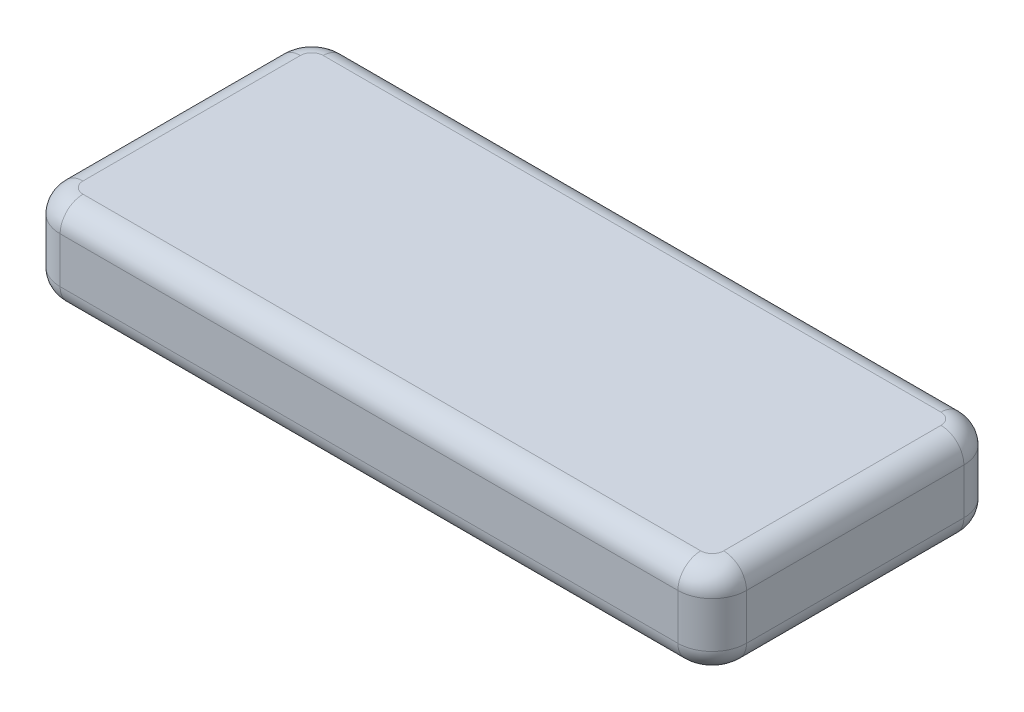
ISO-10303-21;
HEADER;
FILE_DESCRIPTION(('STEP AP214'),'2;1');
FILE_NAME('part.step','',(''),(''),'','','');
FILE_SCHEMA(('AUTOMOTIVE_DESIGN { 1 0 10303 214 1 1 1 1 }'));
ENDSEC;
DATA;
#1=APPLICATION_CONTEXT('core data for automotive mechanical design processes');
#2=APPLICATION_PROTOCOL_DEFINITION('international standard','automotive_design',2000,#1);
#3=PRODUCT_CONTEXT('',#1,'mechanical');
#4=PRODUCT('Part','Part','',(#3));
#5=PRODUCT_RELATED_PRODUCT_CATEGORY('part','',(#4));
#6=PRODUCT_DEFINITION_FORMATION('','',#4);
#7=PRODUCT_DEFINITION_CONTEXT('part definition',#1,'design');
#8=PRODUCT_DEFINITION('design','',#6,#7);
#9=PRODUCT_DEFINITION_SHAPE('','',#8);
#10=(LENGTH_UNIT() NAMED_UNIT(*) SI_UNIT(.MILLI.,.METRE.));
#11=(NAMED_UNIT(*) PLANE_ANGLE_UNIT() SI_UNIT($,.RADIAN.));
#12=(NAMED_UNIT(*) SI_UNIT($,.STERADIAN.) SOLID_ANGLE_UNIT());
#13=UNCERTAINTY_MEASURE_WITH_UNIT(LENGTH_MEASURE(1.E-05),#10,'distance_accuracy_value','');
#14=(GEOMETRIC_REPRESENTATION_CONTEXT(3) GLOBAL_UNCERTAINTY_ASSIGNED_CONTEXT((#13)) GLOBAL_UNIT_ASSIGNED_CONTEXT((#10,
#11,#12)) REPRESENTATION_CONTEXT('',''));
#15=CARTESIAN_POINT('',(0.,0.,0.));
#16=DIRECTION('',(0.,0.,1.));
#17=DIRECTION('',(1.,0.,0.));
#18=AXIS2_PLACEMENT_3D('',#15,#16,#17);
#19=CARTESIAN_POINT('',(27.,4.,9.5));
#20=DIRECTION('',(0.,-1.,0.));
#21=DIRECTION('',(0.,0.,-1.));
#22=AXIS2_PLACEMENT_3D('',#19,#20,#21);
#23=CYLINDRICAL_SURFACE('',#22,3.);
#24=DIRECTION('',(0.,-1.,0.));
#25=VECTOR('',#24,1.);
#26=CARTESIAN_POINT('',(30.,4.,9.49999999999998));
#27=LINE('',#26,#25);
#28=CARTESIAN_POINT('',(30.,2.,9.49999999999998));
#29=VERTEX_POINT('',#28);
#30=CARTESIAN_POINT('',(30.,-2.,9.49999999999998));
#31=VERTEX_POINT('',#30);
#32=EDGE_CURVE('E175',#29,#31,#27,.T.);
#33=ORIENTED_EDGE('',*,*,#32,.F.);
#34=CARTESIAN_POINT('',(27.,2.,9.5));
#35=DIRECTION('',(0.,1.,0.));
#36=DIRECTION('',(0.,0.,1.));
#37=AXIS2_PLACEMENT_3D('',#34,#35,#36);
#38=CIRCLE('',#37,3.);
#39=CARTESIAN_POINT('',(27.,2.,12.5));
#40=VERTEX_POINT('',#39);
#41=EDGE_CURVE('E212',#29,#40,#38,.F.);
#42=ORIENTED_EDGE('',*,*,#41,.T.);
#43=DIRECTION('',(0.,-1.,0.));
#44=VECTOR('',#43,1.);
#45=CARTESIAN_POINT('',(27.,4.,12.5));
#46=LINE('',#45,#44);
#47=CARTESIAN_POINT('',(27.,-2.,12.5));
#48=VERTEX_POINT('',#47);
#49=EDGE_CURVE('E246',#40,#48,#46,.T.);
#50=ORIENTED_EDGE('',*,*,#49,.T.);
#51=CARTESIAN_POINT('',(27.,-2.,9.5));
#52=DIRECTION('',(0.,1.,0.));
#53=DIRECTION('',(0.,0.,1.));
#54=AXIS2_PLACEMENT_3D('',#51,#52,#53);
#55=CIRCLE('',#54,3.);
#56=EDGE_CURVE('E210',#48,#31,#55,.T.);
#57=ORIENTED_EDGE('',*,*,#56,.T.);
#58=EDGE_LOOP('',(#33,#42,#50,#57));
#59=FACE_BOUND('',#58,.T.);
#60=ADVANCED_FACE('F41',(#59),#23,.T.);
#61=CARTESIAN_POINT('',(30.,4.,9.49999999999998));
#62=DIRECTION('',(-1.,0.,0.));
#63=DIRECTION('',(0.,0.,1.));
#64=AXIS2_PLACEMENT_3D('',#61,#62,#63);
#65=PLANE('',#64);
#66=DIRECTION('',(0.,-1.,0.));
#67=VECTOR('',#66,1.);
#68=CARTESIAN_POINT('',(30.,4.,-9.49999999999998));
#69=LINE('',#68,#67);
#70=CARTESIAN_POINT('',(30.,2.,-9.49999999999998));
#71=VERTEX_POINT('',#70);
#72=CARTESIAN_POINT('',(30.,-2.,-9.49999999999998));
#73=VERTEX_POINT('',#72);
#74=EDGE_CURVE('E302',#71,#73,#69,.T.);
#75=ORIENTED_EDGE('',*,*,#74,.F.);
#76=DIRECTION('',(0.,0.,-1.));
#77=VECTOR('',#76,1.);
#78=CARTESIAN_POINT('',(30.,2.,9.49999999999998));
#79=LINE('',#78,#77);
#80=EDGE_CURVE('E208',#71,#29,#79,.F.);
#81=ORIENTED_EDGE('',*,*,#80,.T.);
#82=ORIENTED_EDGE('',*,*,#32,.T.);
#83=DIRECTION('',(0.,0.,-1.));
#84=VECTOR('',#83,1.);
#85=CARTESIAN_POINT('',(30.,-2.,9.49999999999998));
#86=LINE('',#85,#84);
#87=EDGE_CURVE('E205',#31,#73,#86,.T.);
#88=ORIENTED_EDGE('',*,*,#87,.T.);
#89=EDGE_LOOP('',(#75,#81,#82,#88));
#90=FACE_BOUND('',#89,.T.);
#91=ADVANCED_FACE('F299',(#90),#65,.F.);
#92=CARTESIAN_POINT('',(27.,4.,-9.5));
#93=DIRECTION('',(0.,-1.,0.));
#94=DIRECTION('',(0.,0.,-1.));
#95=AXIS2_PLACEMENT_3D('',#92,#93,#94);
#96=CYLINDRICAL_SURFACE('',#95,3.);
#97=DIRECTION('',(0.,-1.,0.));
#98=VECTOR('',#97,1.);
#99=CARTESIAN_POINT('',(27.,4.,-12.5));
#100=LINE('',#99,#98);
#101=CARTESIAN_POINT('',(27.,2.,-12.5));
#102=VERTEX_POINT('',#101);
#103=CARTESIAN_POINT('',(27.,-2.,-12.5));
#104=VERTEX_POINT('',#103);
#105=EDGE_CURVE('E304',#102,#104,#100,.T.);
#106=ORIENTED_EDGE('',*,*,#105,.F.);
#107=CARTESIAN_POINT('',(27.,2.,-9.5));
#108=DIRECTION('',(0.,1.,0.));
#109=DIRECTION('',(0.,0.,1.));
#110=AXIS2_PLACEMENT_3D('',#107,#108,#109);
#111=CIRCLE('',#110,3.);
#112=EDGE_CURVE('E203',#102,#71,#111,.F.);
#113=ORIENTED_EDGE('',*,*,#112,.T.);
#114=ORIENTED_EDGE('',*,*,#74,.T.);
#115=CARTESIAN_POINT('',(27.,-2.,-9.5));
#116=DIRECTION('',(0.,1.,0.));
#117=DIRECTION('',(0.,0.,1.));
#118=AXIS2_PLACEMENT_3D('',#115,#116,#117);
#119=CIRCLE('',#118,3.);
#120=EDGE_CURVE('E201',#73,#104,#119,.T.);
#121=ORIENTED_EDGE('',*,*,#120,.T.);
#122=EDGE_LOOP('',(#106,#113,#114,#121));
#123=FACE_BOUND('',#122,.T.);
#124=ADVANCED_FACE('F373',(#123),#96,.T.);
#125=CARTESIAN_POINT('',(-27.,4.,-12.5));
#126=DIRECTION('',(0.,0.,1.));
#127=DIRECTION('',(1.,0.,0.));
#128=AXIS2_PLACEMENT_3D('',#125,#126,#127);
#129=PLANE('',#128);
#130=DIRECTION('',(0.,-1.,0.));
#131=VECTOR('',#130,1.);
#132=CARTESIAN_POINT('',(-27.,4.,-12.5));
#133=LINE('',#132,#131);
#134=CARTESIAN_POINT('',(-27.,2.,-12.5));
#135=VERTEX_POINT('',#134);
#136=CARTESIAN_POINT('',(-27.,-2.,-12.5));
#137=VERTEX_POINT('',#136);
#138=EDGE_CURVE('E338',#135,#137,#133,.T.);
#139=ORIENTED_EDGE('',*,*,#138,.F.);
#140=DIRECTION('',(-1.,0.,0.));
#141=VECTOR('',#140,1.);
#142=CARTESIAN_POINT('',(27.,2.,-12.5));
#143=LINE('',#142,#141);
#144=EDGE_CURVE('E199',#135,#102,#143,.F.);
#145=ORIENTED_EDGE('',*,*,#144,.T.);
#146=ORIENTED_EDGE('',*,*,#105,.T.);
#147=DIRECTION('',(-1.,0.,0.));
#148=VECTOR('',#147,1.);
#149=CARTESIAN_POINT('',(-27.,-2.,-12.5));
#150=LINE('',#149,#148);
#151=EDGE_CURVE('E197',#104,#137,#150,.T.);
#152=ORIENTED_EDGE('',*,*,#151,.T.);
#153=EDGE_LOOP('',(#139,#145,#146,#152));
#154=FACE_BOUND('',#153,.T.);
#155=ADVANCED_FACE('F349',(#154),#129,.F.);
#156=CARTESIAN_POINT('',(-27.,4.,-9.5));
#157=DIRECTION('',(0.,-1.,0.));
#158=DIRECTION('',(0.,0.,-1.));
#159=AXIS2_PLACEMENT_3D('',#156,#157,#158);
#160=CYLINDRICAL_SURFACE('',#159,3.);
#161=DIRECTION('',(0.,-1.,0.));
#162=VECTOR('',#161,1.);
#163=CARTESIAN_POINT('',(-30.,4.,-9.49999999999998));
#164=LINE('',#163,#162);
#165=CARTESIAN_POINT('',(-30.,2.,-9.49999999999998));
#166=VERTEX_POINT('',#165);
#167=CARTESIAN_POINT('',(-30.,-2.,-9.49999999999998));
#168=VERTEX_POINT('',#167);
#169=EDGE_CURVE('E336',#166,#168,#164,.T.);
#170=ORIENTED_EDGE('',*,*,#169,.F.);
#171=CARTESIAN_POINT('',(-27.,2.,-9.5));
#172=DIRECTION('',(0.,1.,0.));
#173=DIRECTION('',(0.,0.,1.));
#174=AXIS2_PLACEMENT_3D('',#171,#172,#173);
#175=CIRCLE('',#174,3.);
#176=EDGE_CURVE('E195',#166,#135,#175,.F.);
#177=ORIENTED_EDGE('',*,*,#176,.T.);
#178=ORIENTED_EDGE('',*,*,#138,.T.);
#179=CARTESIAN_POINT('',(-27.,-2.,-9.5));
#180=DIRECTION('',(0.,1.,0.));
#181=DIRECTION('',(0.,0.,1.));
#182=AXIS2_PLACEMENT_3D('',#179,#180,#181);
#183=CIRCLE('',#182,3.);
#184=EDGE_CURVE('E193',#137,#168,#183,.T.);
#185=ORIENTED_EDGE('',*,*,#184,.T.);
#186=EDGE_LOOP('',(#170,#177,#178,#185));
#187=FACE_BOUND('',#186,.T.);
#188=ADVANCED_FACE('F421',(#187),#160,.T.);
#189=CARTESIAN_POINT('',(-30.,4.,9.49999999999998));
#190=DIRECTION('',(1.,0.,0.));
#191=DIRECTION('',(0.,0.,-1.));
#192=AXIS2_PLACEMENT_3D('',#189,#190,#191);
#193=PLANE('',#192);
#194=DIRECTION('',(0.,-1.,0.));
#195=VECTOR('',#194,1.);
#196=CARTESIAN_POINT('',(-30.,4.,9.49999999999998));
#197=LINE('',#196,#195);
#198=CARTESIAN_POINT('',(-30.,2.,9.49999999999998));
#199=VERTEX_POINT('',#198);
#200=CARTESIAN_POINT('',(-30.,-2.,9.49999999999998));
#201=VERTEX_POINT('',#200);
#202=EDGE_CURVE('E332',#199,#201,#197,.T.);
#203=ORIENTED_EDGE('',*,*,#202,.F.);
#204=DIRECTION('',(0.,0.,1.));
#205=VECTOR('',#204,1.);
#206=CARTESIAN_POINT('',(-30.,2.,-9.49999999999998));
#207=LINE('',#206,#205);
#208=EDGE_CURVE('E191',#199,#166,#207,.F.);
#209=ORIENTED_EDGE('',*,*,#208,.T.);
#210=ORIENTED_EDGE('',*,*,#169,.T.);
#211=DIRECTION('',(0.,0.,1.));
#212=VECTOR('',#211,1.);
#213=CARTESIAN_POINT('',(-30.,-2.,9.49999999999998));
#214=LINE('',#213,#212);
#215=EDGE_CURVE('E189',#168,#201,#214,.T.);
#216=ORIENTED_EDGE('',*,*,#215,.T.);
#217=EDGE_LOOP('',(#203,#209,#210,#216));
#218=FACE_BOUND('',#217,.T.);
#219=ADVANCED_FACE('F335',(#218),#193,.F.);
#220=CARTESIAN_POINT('',(-27.,4.,9.5));
#221=DIRECTION('',(0.,-1.,0.));
#222=DIRECTION('',(0.,0.,-1.));
#223=AXIS2_PLACEMENT_3D('',#220,#221,#222);
#224=CYLINDRICAL_SURFACE('',#223,3.);
#225=DIRECTION('',(0.,-1.,0.));
#226=VECTOR('',#225,1.);
#227=CARTESIAN_POINT('',(-27.,4.,12.5));
#228=LINE('',#227,#226);
#229=CARTESIAN_POINT('',(-27.,2.,12.5));
#230=VERTEX_POINT('',#229);
#231=CARTESIAN_POINT('',(-27.,-2.,12.5));
#232=VERTEX_POINT('',#231);
#233=EDGE_CURVE('E334',#230,#232,#228,.T.);
#234=ORIENTED_EDGE('',*,*,#233,.F.);
#235=CARTESIAN_POINT('',(-27.,2.,9.5));
#236=DIRECTION('',(0.,1.,0.));
#237=DIRECTION('',(0.,0.,1.));
#238=AXIS2_PLACEMENT_3D('',#235,#236,#237);
#239=CIRCLE('',#238,3.);
#240=EDGE_CURVE('E162',#230,#199,#239,.F.);
#241=ORIENTED_EDGE('',*,*,#240,.T.);
#242=ORIENTED_EDGE('',*,*,#202,.T.);
#243=CARTESIAN_POINT('',(-27.,-2.,9.5));
#244=DIRECTION('',(0.,1.,0.));
#245=DIRECTION('',(0.,0.,1.));
#246=AXIS2_PLACEMENT_3D('',#243,#244,#245);
#247=CIRCLE('',#246,3.);
#248=EDGE_CURVE('E181',#201,#232,#247,.T.);
#249=ORIENTED_EDGE('',*,*,#248,.T.);
#250=EDGE_LOOP('',(#234,#241,#242,#249));
#251=FACE_BOUND('',#250,.T.);
#252=ADVANCED_FACE('F331',(#251),#224,.T.);
#253=CARTESIAN_POINT('',(-27.,4.,12.5));
#254=DIRECTION('',(0.,0.,-1.));
#255=DIRECTION('',(-1.,0.,0.));
#256=AXIS2_PLACEMENT_3D('',#253,#254,#255);
#257=PLANE('',#256);
#258=ORIENTED_EDGE('',*,*,#233,.T.);
#259=DIRECTION('',(1.,0.,0.));
#260=VECTOR('',#259,1.);
#261=CARTESIAN_POINT('',(-27.,-2.,12.5));
#262=LINE('',#261,#260);
#263=EDGE_CURVE('E11',#232,#48,#262,.T.);
#264=ORIENTED_EDGE('',*,*,#263,.T.);
#265=ORIENTED_EDGE('',*,*,#49,.F.);
#266=DIRECTION('',(1.,0.,0.));
#267=VECTOR('',#266,1.);
#268=CARTESIAN_POINT('',(-27.,2.,12.5));
#269=LINE('',#268,#267);
#270=EDGE_CURVE('E50',#40,#230,#269,.F.);
#271=ORIENTED_EDGE('',*,*,#270,.T.);
#272=EDGE_LOOP('',(#258,#264,#265,#271));
#273=FACE_BOUND('',#272,.T.);
#274=ADVANCED_FACE('F409',(#273),#257,.F.);
#275=CARTESIAN_POINT('',(27.,4.,9.5));
#276=DIRECTION('',(0.,1.,0.));
#277=DIRECTION('',(0.,0.,1.));
#278=AXIS2_PLACEMENT_3D('',#275,#276,#277);
#279=PLANE('',#278);
#280=DIRECTION('',(0.,0.,1.));
#281=VECTOR('',#280,1.);
#282=CARTESIAN_POINT('',(-28.,4.,9.49999999999998));
#283=LINE('',#282,#281);
#284=CARTESIAN_POINT('',(-28.,4.,-9.49999999999998));
#285=VERTEX_POINT('',#284);
#286=CARTESIAN_POINT('',(-28.,4.,9.49999999999999));
#287=VERTEX_POINT('',#286);
#288=EDGE_CURVE('E179',#285,#287,#283,.T.);
#289=ORIENTED_EDGE('',*,*,#288,.T.);
#290=CARTESIAN_POINT('',(-27.,4.,9.5));
#291=DIRECTION('',(0.,1.,0.));
#292=DIRECTION('',(0.,0.,1.));
#293=AXIS2_PLACEMENT_3D('',#290,#291,#292);
#294=CIRCLE('',#293,0.999999999999999);
#295=CARTESIAN_POINT('',(-27.,4.,10.5));
#296=VERTEX_POINT('',#295);
#297=EDGE_CURVE('E160',#287,#296,#294,.T.);
#298=ORIENTED_EDGE('',*,*,#297,.T.);
#299=DIRECTION('',(1.,0.,0.));
#300=VECTOR('',#299,1.);
#301=CARTESIAN_POINT('',(27.,4.,10.5));
#302=LINE('',#301,#300);
#303=CARTESIAN_POINT('',(27.,4.,10.5));
#304=VERTEX_POINT('',#303);
#305=EDGE_CURVE('E168',#296,#304,#302,.T.);
#306=ORIENTED_EDGE('',*,*,#305,.T.);
#307=CARTESIAN_POINT('',(27.,4.,9.5));
#308=DIRECTION('',(0.,1.,0.));
#309=DIRECTION('',(0.,0.,1.));
#310=AXIS2_PLACEMENT_3D('',#307,#308,#309);
#311=CIRCLE('',#310,0.999999999999999);
#312=CARTESIAN_POINT('',(28.,4.,9.49999999999998));
#313=VERTEX_POINT('',#312);
#314=EDGE_CURVE('E174',#304,#313,#311,.T.);
#315=ORIENTED_EDGE('',*,*,#314,.T.);
#316=DIRECTION('',(0.,0.,-1.));
#317=VECTOR('',#316,1.);
#318=CARTESIAN_POINT('',(28.,4.,-9.49999999999998));
#319=LINE('',#318,#317);
#320=CARTESIAN_POINT('',(28.,4.,-9.49999999999999));
#321=VERTEX_POINT('',#320);
#322=EDGE_CURVE('E309',#313,#321,#319,.T.);
#323=ORIENTED_EDGE('',*,*,#322,.T.);
#324=CARTESIAN_POINT('',(27.,4.,-9.5));
#325=DIRECTION('',(0.,1.,0.));
#326=DIRECTION('',(0.,0.,1.));
#327=AXIS2_PLACEMENT_3D('',#324,#325,#326);
#328=CIRCLE('',#327,0.999999999999999);
#329=CARTESIAN_POINT('',(27.,4.,-10.5));
#330=VERTEX_POINT('',#329);
#331=EDGE_CURVE('E311',#321,#330,#328,.T.);
#332=ORIENTED_EDGE('',*,*,#331,.T.);
#333=DIRECTION('',(-1.,0.,0.));
#334=VECTOR('',#333,1.);
#335=CARTESIAN_POINT('',(-27.,4.,-10.5));
#336=LINE('',#335,#334);
#337=CARTESIAN_POINT('',(-27.,4.,-10.5));
#338=VERTEX_POINT('',#337);
#339=EDGE_CURVE('E313',#330,#338,#336,.T.);
#340=ORIENTED_EDGE('',*,*,#339,.T.);
#341=CARTESIAN_POINT('',(-27.,4.,-9.5));
#342=DIRECTION('',(0.,1.,0.));
#343=DIRECTION('',(0.,0.,1.));
#344=AXIS2_PLACEMENT_3D('',#341,#342,#343);
#345=CIRCLE('',#344,0.999999999999999);
#346=EDGE_CURVE('E184',#338,#285,#345,.T.);
#347=ORIENTED_EDGE('',*,*,#346,.T.);
#348=EDGE_LOOP('',(#289,#298,#306,#315,#323,#332,#340,#347));
#349=FACE_BOUND('',#348,.T.);
#350=ADVANCED_FACE('F177',(#349),#279,.T.);
#351=CARTESIAN_POINT('',(27.,-4.,9.5));
#352=DIRECTION('',(0.,1.,0.));
#353=DIRECTION('',(0.,0.,1.));
#354=AXIS2_PLACEMENT_3D('',#351,#352,#353);
#355=PLANE('',#354);
#356=CARTESIAN_POINT('',(27.,-4.,-9.5));
#357=DIRECTION('',(0.,1.,0.));
#358=DIRECTION('',(0.,0.,1.));
#359=AXIS2_PLACEMENT_3D('',#356,#357,#358);
#360=CIRCLE('',#359,0.999999999999999);
#361=CARTESIAN_POINT('',(27.,-4.,-10.5));
#362=VERTEX_POINT('',#361);
#363=CARTESIAN_POINT('',(28.,-4.,-9.49999999999998));
#364=VERTEX_POINT('',#363);
#365=EDGE_CURVE('E58',#362,#364,#360,.F.);
#366=ORIENTED_EDGE('',*,*,#365,.T.);
#367=DIRECTION('',(0.,0.,-1.));
#368=VECTOR('',#367,1.);
#369=CARTESIAN_POINT('',(28.,-4.,9.5));
#370=LINE('',#369,#368);
#371=CARTESIAN_POINT('',(28.,-4.,9.49999999999998));
#372=VERTEX_POINT('',#371);
#373=EDGE_CURVE('E226',#364,#372,#370,.F.);
#374=ORIENTED_EDGE('',*,*,#373,.T.);
#375=CARTESIAN_POINT('',(27.,-4.,9.5));
#376=DIRECTION('',(0.,1.,0.));
#377=DIRECTION('',(0.,0.,1.));
#378=AXIS2_PLACEMENT_3D('',#375,#376,#377);
#379=CIRCLE('',#378,0.999999999999999);
#380=CARTESIAN_POINT('',(27.,-4.,10.5));
#381=VERTEX_POINT('',#380);
#382=EDGE_CURVE('E214',#372,#381,#379,.F.);
#383=ORIENTED_EDGE('',*,*,#382,.T.);
#384=DIRECTION('',(1.,0.,0.));
#385=VECTOR('',#384,1.);
#386=CARTESIAN_POINT('',(27.,-4.,10.5));
#387=LINE('',#386,#385);
#388=CARTESIAN_POINT('',(-27.,-4.,10.5));
#389=VERTEX_POINT('',#388);
#390=EDGE_CURVE('E216',#381,#389,#387,.F.);
#391=ORIENTED_EDGE('',*,*,#390,.T.);
#392=CARTESIAN_POINT('',(-27.,-4.,9.5));
#393=DIRECTION('',(0.,1.,0.));
#394=DIRECTION('',(0.,0.,1.));
#395=AXIS2_PLACEMENT_3D('',#392,#393,#394);
#396=CIRCLE('',#395,0.999999999999999);
#397=CARTESIAN_POINT('',(-28.,-4.,9.49999999999998));
#398=VERTEX_POINT('',#397);
#399=EDGE_CURVE('E218',#389,#398,#396,.F.);
#400=ORIENTED_EDGE('',*,*,#399,.T.);
#401=DIRECTION('',(0.,0.,1.));
#402=VECTOR('',#401,1.);
#403=CARTESIAN_POINT('',(-28.,-4.,9.5));
#404=LINE('',#403,#402);
#405=CARTESIAN_POINT('',(-28.,-4.,-9.49999999999999));
#406=VERTEX_POINT('',#405);
#407=EDGE_CURVE('E220',#398,#406,#404,.F.);
#408=ORIENTED_EDGE('',*,*,#407,.T.);
#409=CARTESIAN_POINT('',(-27.,-4.,-9.5));
#410=DIRECTION('',(0.,1.,0.));
#411=DIRECTION('',(0.,0.,1.));
#412=AXIS2_PLACEMENT_3D('',#409,#410,#411);
#413=CIRCLE('',#412,0.999999999999999);
#414=CARTESIAN_POINT('',(-27.,-4.,-10.5));
#415=VERTEX_POINT('',#414);
#416=EDGE_CURVE('E222',#406,#415,#413,.F.);
#417=ORIENTED_EDGE('',*,*,#416,.T.);
#418=DIRECTION('',(-1.,0.,0.));
#419=VECTOR('',#418,1.);
#420=CARTESIAN_POINT('',(27.,-4.,-10.5));
#421=LINE('',#420,#419);
#422=EDGE_CURVE('E63',#415,#362,#421,.F.);
#423=ORIENTED_EDGE('',*,*,#422,.T.);
#424=EDGE_LOOP('',(#366,#374,#383,#391,#400,#408,#417,#423));
#425=FACE_BOUND('',#424,.T.);
#426=ADVANCED_FACE('F278',(#425),#355,.F.);
#427=CARTESIAN_POINT('',(27.,2.,-9.5));
#428=DIRECTION('',(0.,1.,0.));
#429=DIRECTION('',(0.,0.,1.));
#430=AXIS2_PLACEMENT_3D('',#427,#428,#429);
#431=DEGENERATE_TOROIDAL_SURFACE('',#430,0.999999999999999,2.,.T.);
#432=CARTESIAN_POINT('',(28.,2.,-9.49999999999999));
#433=DIRECTION('',(0.,0.,1.));
#434=DIRECTION('',(1.,0.,0.));
#435=AXIS2_PLACEMENT_3D('',#432,#433,#434);
#436=CIRCLE('',#435,2.);
#437=EDGE_CURVE('E240',#71,#321,#436,.T.);
#438=ORIENTED_EDGE('',*,*,#437,.F.);
#439=ORIENTED_EDGE('',*,*,#112,.F.);
#440=CARTESIAN_POINT('',(27.,2.,-10.5));
#441=DIRECTION('',(-1.,0.,0.));
#442=DIRECTION('',(0.,0.,1.));
#443=AXIS2_PLACEMENT_3D('',#440,#441,#442);
#444=CIRCLE('',#443,2.);
#445=EDGE_CURVE('E243',#330,#102,#444,.T.);
#446=ORIENTED_EDGE('',*,*,#445,.F.);
#447=ORIENTED_EDGE('',*,*,#331,.F.);
#448=EDGE_LOOP('',(#438,#439,#446,#447));
#449=FACE_BOUND('',#448,.T.);
#450=ADVANCED_FACE('F395',(#449),#431,.T.);
#451=CARTESIAN_POINT('',(27.,2.,-10.5));
#452=DIRECTION('',(1.,0.,0.));
#453=DIRECTION('',(0.,0.,-1.));
#454=AXIS2_PLACEMENT_3D('',#451,#452,#453);
#455=CYLINDRICAL_SURFACE('',#454,2.);
#456=ORIENTED_EDGE('',*,*,#445,.T.);
#457=ORIENTED_EDGE('',*,*,#144,.F.);
#458=CARTESIAN_POINT('',(-27.,2.,-10.5));
#459=DIRECTION('',(-1.,0.,0.));
#460=DIRECTION('',(0.,0.,1.));
#461=AXIS2_PLACEMENT_3D('',#458,#459,#460);
#462=CIRCLE('',#461,2.);
#463=EDGE_CURVE('E237',#338,#135,#462,.T.);
#464=ORIENTED_EDGE('',*,*,#463,.F.);
#465=ORIENTED_EDGE('',*,*,#339,.F.);
#466=EDGE_LOOP('',(#456,#457,#464,#465));
#467=FACE_BOUND('',#466,.T.);
#468=ADVANCED_FACE('F392',(#467),#455,.T.);
#469=CARTESIAN_POINT('',(28.,2.,9.5));
#470=DIRECTION('',(0.,0.,1.));
#471=DIRECTION('',(1.,0.,0.));
#472=AXIS2_PLACEMENT_3D('',#469,#470,#471);
#473=CYLINDRICAL_SURFACE('',#472,2.);
#474=ORIENTED_EDGE('',*,*,#437,.T.);
#475=ORIENTED_EDGE('',*,*,#322,.F.);
#476=CARTESIAN_POINT('',(28.,2.,9.49999999999998));
#477=DIRECTION('',(0.,0.,1.));
#478=DIRECTION('',(1.,0.,0.));
#479=AXIS2_PLACEMENT_3D('',#476,#477,#478);
#480=CIRCLE('',#479,2.);
#481=EDGE_CURVE('E234',#29,#313,#480,.T.);
#482=ORIENTED_EDGE('',*,*,#481,.F.);
#483=ORIENTED_EDGE('',*,*,#80,.F.);
#484=EDGE_LOOP('',(#474,#475,#482,#483));
#485=FACE_BOUND('',#484,.T.);
#486=ADVANCED_FACE('F389',(#485),#473,.T.);
#487=CARTESIAN_POINT('',(-27.,2.,-9.5));
#488=DIRECTION('',(0.,1.,0.));
#489=DIRECTION('',(0.,0.,1.));
#490=AXIS2_PLACEMENT_3D('',#487,#488,#489);
#491=DEGENERATE_TOROIDAL_SURFACE('',#490,0.999999999999999,2.,.T.);
#492=ORIENTED_EDGE('',*,*,#463,.T.);
#493=ORIENTED_EDGE('',*,*,#176,.F.);
#494=CARTESIAN_POINT('',(-28.,2.,-9.49999999999998));
#495=DIRECTION('',(0.,0.,1.));
#496=DIRECTION('',(1.,0.,0.));
#497=AXIS2_PLACEMENT_3D('',#494,#495,#496);
#498=CIRCLE('',#497,2.);
#499=EDGE_CURVE('E231',#285,#166,#498,.T.);
#500=ORIENTED_EDGE('',*,*,#499,.F.);
#501=ORIENTED_EDGE('',*,*,#346,.F.);
#502=EDGE_LOOP('',(#492,#493,#500,#501));
#503=FACE_BOUND('',#502,.T.);
#504=ADVANCED_FACE('F320',(#503),#491,.T.);
#505=CARTESIAN_POINT('',(27.,2.,9.5));
#506=DIRECTION('',(0.,1.,0.));
#507=DIRECTION('',(0.,0.,1.));
#508=AXIS2_PLACEMENT_3D('',#505,#506,#507);
#509=DEGENERATE_TOROIDAL_SURFACE('',#508,0.999999999999999,2.,.T.);
#510=ORIENTED_EDGE('',*,*,#481,.T.);
#511=ORIENTED_EDGE('',*,*,#314,.F.);
#512=CARTESIAN_POINT('',(27.,2.,10.5));
#513=DIRECTION('',(-1.,0.,0.));
#514=DIRECTION('',(0.,0.,1.));
#515=AXIS2_PLACEMENT_3D('',#512,#513,#514);
#516=CIRCLE('',#515,2.);
#517=EDGE_CURVE('E171',#40,#304,#516,.T.);
#518=ORIENTED_EDGE('',*,*,#517,.F.);
#519=ORIENTED_EDGE('',*,*,#41,.F.);
#520=EDGE_LOOP('',(#510,#511,#518,#519));
#521=FACE_BOUND('',#520,.T.);
#522=ADVANCED_FACE('F383',(#521),#509,.T.);
#523=CARTESIAN_POINT('',(-28.,2.,9.5));
#524=DIRECTION('',(0.,0.,-1.));
#525=DIRECTION('',(-1.,0.,0.));
#526=AXIS2_PLACEMENT_3D('',#523,#524,#525);
#527=CYLINDRICAL_SURFACE('',#526,2.);
#528=ORIENTED_EDGE('',*,*,#499,.T.);
#529=ORIENTED_EDGE('',*,*,#208,.F.);
#530=CARTESIAN_POINT('',(-28.,2.,9.49999999999999));
#531=DIRECTION('',(0.,0.,1.));
#532=DIRECTION('',(1.,0.,0.));
#533=AXIS2_PLACEMENT_3D('',#530,#531,#532);
#534=CIRCLE('',#533,2.);
#535=EDGE_CURVE('E165',#287,#199,#534,.T.);
#536=ORIENTED_EDGE('',*,*,#535,.F.);
#537=ORIENTED_EDGE('',*,*,#288,.F.);
#538=EDGE_LOOP('',(#528,#529,#536,#537));
#539=FACE_BOUND('',#538,.T.);
#540=ADVANCED_FACE('F323',(#539),#527,.T.);
#541=CARTESIAN_POINT('',(27.,2.,10.5));
#542=DIRECTION('',(-1.,0.,0.));
#543=DIRECTION('',(0.,0.,1.));
#544=AXIS2_PLACEMENT_3D('',#541,#542,#543);
#545=CYLINDRICAL_SURFACE('',#544,2.);
#546=ORIENTED_EDGE('',*,*,#517,.T.);
#547=ORIENTED_EDGE('',*,*,#305,.F.);
#548=CARTESIAN_POINT('',(-27.,2.,10.5));
#549=DIRECTION('',(-1.,0.,0.));
#550=DIRECTION('',(0.,-1.,0.));
#551=AXIS2_PLACEMENT_3D('',#548,#549,#550);
#552=CIRCLE('',#551,2.);
#553=EDGE_CURVE('E156',#230,#296,#552,.T.);
#554=ORIENTED_EDGE('',*,*,#553,.F.);
#555=ORIENTED_EDGE('',*,*,#270,.F.);
#556=EDGE_LOOP('',(#546,#547,#554,#555));
#557=FACE_BOUND('',#556,.T.);
#558=ADVANCED_FACE('F169',(#557),#545,.T.);
#559=CARTESIAN_POINT('',(-27.,2.,9.5));
#560=DIRECTION('',(0.,1.,0.));
#561=DIRECTION('',(0.,0.,1.));
#562=AXIS2_PLACEMENT_3D('',#559,#560,#561);
#563=DEGENERATE_TOROIDAL_SURFACE('',#562,0.999999999999999,2.,.T.);
#564=ORIENTED_EDGE('',*,*,#535,.T.);
#565=ORIENTED_EDGE('',*,*,#240,.F.);
#566=ORIENTED_EDGE('',*,*,#553,.T.);
#567=ORIENTED_EDGE('',*,*,#297,.F.);
#568=EDGE_LOOP('',(#564,#565,#566,#567));
#569=FACE_BOUND('',#568,.T.);
#570=ADVANCED_FACE('F158',(#569),#563,.T.);
#571=CARTESIAN_POINT('',(-28.,-2.,9.49999999999998));
#572=DIRECTION('',(0.,0.,1.));
#573=DIRECTION('',(1.,0.,0.));
#574=AXIS2_PLACEMENT_3D('',#571,#572,#573);
#575=CYLINDRICAL_SURFACE('',#574,2.);
#576=CARTESIAN_POINT('',(-28.,-2.,-9.49999999999999));
#577=DIRECTION('',(0.,0.,-1.));
#578=DIRECTION('',(-1.,0.,0.));
#579=AXIS2_PLACEMENT_3D('',#576,#577,#578);
#580=CIRCLE('',#579,2.);
#581=EDGE_CURVE('E262',#406,#168,#580,.T.);
#582=ORIENTED_EDGE('',*,*,#581,.F.);
#583=ORIENTED_EDGE('',*,*,#407,.F.);
#584=CARTESIAN_POINT('',(-28.,-2.,9.49999999999998));
#585=DIRECTION('',(0.,0.,1.));
#586=DIRECTION('',(1.,0.,0.));
#587=AXIS2_PLACEMENT_3D('',#584,#585,#586);
#588=CIRCLE('',#587,2.);
#589=EDGE_CURVE('E45',#201,#398,#588,.T.);
#590=ORIENTED_EDGE('',*,*,#589,.F.);
#591=ORIENTED_EDGE('',*,*,#215,.F.);
#592=EDGE_LOOP('',(#582,#583,#590,#591));
#593=FACE_BOUND('',#592,.T.);
#594=ADVANCED_FACE('F43',(#593),#575,.T.);
#595=CARTESIAN_POINT('',(-27.,-2.,9.5));
#596=DIRECTION('',(0.,1.,0.));
#597=DIRECTION('',(0.,0.,1.));
#598=AXIS2_PLACEMENT_3D('',#595,#596,#597);
#599=DEGENERATE_TOROIDAL_SURFACE('',#598,0.999999999999999,2.,.T.);
#600=ORIENTED_EDGE('',*,*,#589,.T.);
#601=ORIENTED_EDGE('',*,*,#399,.F.);
#602=CARTESIAN_POINT('',(-27.,-2.,10.5));
#603=DIRECTION('',(1.,0.,0.));
#604=DIRECTION('',(0.,0.,-1.));
#605=AXIS2_PLACEMENT_3D('',#602,#603,#604);
#606=CIRCLE('',#605,2.);
#607=EDGE_CURVE('E260',#232,#389,#606,.T.);
#608=ORIENTED_EDGE('',*,*,#607,.F.);
#609=ORIENTED_EDGE('',*,*,#248,.F.);
#610=EDGE_LOOP('',(#600,#601,#608,#609));
#611=FACE_BOUND('',#610,.T.);
#612=ADVANCED_FACE('F273',(#611),#599,.T.);
#613=CARTESIAN_POINT('',(-27.,-2.,-9.5));
#614=DIRECTION('',(0.,1.,0.));
#615=DIRECTION('',(0.,0.,1.));
#616=AXIS2_PLACEMENT_3D('',#613,#614,#615);
#617=DEGENERATE_TOROIDAL_SURFACE('',#616,0.999999999999999,2.,.T.);
#618=ORIENTED_EDGE('',*,*,#581,.T.);
#619=ORIENTED_EDGE('',*,*,#184,.F.);
#620=CARTESIAN_POINT('',(-27.,-2.,-10.5));
#621=DIRECTION('',(1.,0.,0.));
#622=DIRECTION('',(0.,0.,-1.));
#623=AXIS2_PLACEMENT_3D('',#620,#621,#622);
#624=CIRCLE('',#623,2.);
#625=EDGE_CURVE('E257',#415,#137,#624,.T.);
#626=ORIENTED_EDGE('',*,*,#625,.F.);
#627=ORIENTED_EDGE('',*,*,#416,.F.);
#628=EDGE_LOOP('',(#618,#619,#626,#627));
#629=FACE_BOUND('',#628,.T.);
#630=ADVANCED_FACE('F530',(#629),#617,.T.);
#631=CARTESIAN_POINT('',(-27.,-2.,10.5));
#632=DIRECTION('',(1.,0.,0.));
#633=DIRECTION('',(0.,0.,-1.));
#634=AXIS2_PLACEMENT_3D('',#631,#632,#633);
#635=CYLINDRICAL_SURFACE('',#634,2.);
#636=ORIENTED_EDGE('',*,*,#607,.T.);
#637=ORIENTED_EDGE('',*,*,#390,.F.);
#638=CARTESIAN_POINT('',(27.,-2.,10.5));
#639=DIRECTION('',(1.,0.,0.));
#640=DIRECTION('',(0.,0.,-1.));
#641=AXIS2_PLACEMENT_3D('',#638,#639,#640);
#642=CIRCLE('',#641,2.);
#643=EDGE_CURVE('E254',#48,#381,#642,.T.);
#644=ORIENTED_EDGE('',*,*,#643,.F.);
#645=ORIENTED_EDGE('',*,*,#263,.F.);
#646=EDGE_LOOP('',(#636,#637,#644,#645));
#647=FACE_BOUND('',#646,.T.);
#648=ADVANCED_FACE('F284',(#647),#635,.T.);
#649=CARTESIAN_POINT('',(-27.,-2.,-10.5));
#650=DIRECTION('',(-1.,0.,0.));
#651=DIRECTION('',(0.,0.,1.));
#652=AXIS2_PLACEMENT_3D('',#649,#650,#651);
#653=CYLINDRICAL_SURFACE('',#652,2.);
#654=ORIENTED_EDGE('',*,*,#625,.T.);
#655=ORIENTED_EDGE('',*,*,#151,.F.);
#656=CARTESIAN_POINT('',(27.,-2.,-10.5));
#657=DIRECTION('',(1.,0.,0.));
#658=DIRECTION('',(0.,0.,-1.));
#659=AXIS2_PLACEMENT_3D('',#656,#657,#658);
#660=CIRCLE('',#659,2.);
#661=EDGE_CURVE('E251',#362,#104,#660,.T.);
#662=ORIENTED_EDGE('',*,*,#661,.F.);
#663=ORIENTED_EDGE('',*,*,#422,.F.);
#664=EDGE_LOOP('',(#654,#655,#662,#663));
#665=FACE_BOUND('',#664,.T.);
#666=ADVANCED_FACE('F354',(#665),#653,.T.);
#667=CARTESIAN_POINT('',(27.,-2.,9.5));
#668=DIRECTION('',(0.,1.,0.));
#669=DIRECTION('',(0.,0.,1.));
#670=AXIS2_PLACEMENT_3D('',#667,#668,#669);
#671=DEGENERATE_TOROIDAL_SURFACE('',#670,0.999999999999999,2.,.T.);
#672=ORIENTED_EDGE('',*,*,#643,.T.);
#673=ORIENTED_EDGE('',*,*,#382,.F.);
#674=CARTESIAN_POINT('',(28.,-2.,9.49999999999999));
#675=DIRECTION('',(0.,0.,-1.));
#676=DIRECTION('',(0.,1.,0.));
#677=AXIS2_PLACEMENT_3D('',#674,#675,#676);
#678=CIRCLE('',#677,2.);
#679=EDGE_CURVE('E249',#31,#372,#678,.T.);
#680=ORIENTED_EDGE('',*,*,#679,.F.);
#681=ORIENTED_EDGE('',*,*,#56,.F.);
#682=EDGE_LOOP('',(#672,#673,#680,#681));
#683=FACE_BOUND('',#682,.T.);
#684=ADVANCED_FACE('F288',(#683),#671,.T.);
#685=CARTESIAN_POINT('',(27.,-2.,-9.5));
#686=DIRECTION('',(0.,1.,0.));
#687=DIRECTION('',(0.,0.,1.));
#688=AXIS2_PLACEMENT_3D('',#685,#686,#687);
#689=DEGENERATE_TOROIDAL_SURFACE('',#688,0.999999999999999,2.,.T.);
#690=ORIENTED_EDGE('',*,*,#661,.T.);
#691=ORIENTED_EDGE('',*,*,#120,.F.);
#692=CARTESIAN_POINT('',(28.,-2.,-9.49999999999998));
#693=DIRECTION('',(0.,0.,1.));
#694=DIRECTION('',(1.,0.,0.));
#695=AXIS2_PLACEMENT_3D('',#692,#693,#694);
#696=CIRCLE('',#695,2.);
#697=EDGE_CURVE('E247',#364,#73,#696,.T.);
#698=ORIENTED_EDGE('',*,*,#697,.F.);
#699=ORIENTED_EDGE('',*,*,#365,.F.);
#700=EDGE_LOOP('',(#690,#691,#698,#699));
#701=FACE_BOUND('',#700,.T.);
#702=ADVANCED_FACE('F357',(#701),#689,.T.);
#703=CARTESIAN_POINT('',(28.,-2.,9.49999999999998));
#704=DIRECTION('',(0.,0.,-1.));
#705=DIRECTION('',(-1.,0.,0.));
#706=AXIS2_PLACEMENT_3D('',#703,#704,#705);
#707=CYLINDRICAL_SURFACE('',#706,2.);
#708=ORIENTED_EDGE('',*,*,#679,.T.);
#709=ORIENTED_EDGE('',*,*,#373,.F.);
#710=ORIENTED_EDGE('',*,*,#697,.T.);
#711=ORIENTED_EDGE('',*,*,#87,.F.);
#712=EDGE_LOOP('',(#708,#709,#710,#711));
#713=FACE_BOUND('',#712,.T.);
#714=ADVANCED_FACE('F360',(#713),#707,.T.);
#715=CLOSED_SHELL('',(#60,#91,#124,#155,#188,#219,#252,#274,#350,#426,#450,#468,#486,#504,#522,
#540,#558,#570,#594,#612,#630,#648,#666,#684,#702,#714));
#716=MANIFOLD_SOLID_BREP('B2',#715);
#717=ADVANCED_BREP_SHAPE_REPRESENTATION('',(#18,#716),#14);
#718=SHAPE_DEFINITION_REPRESENTATION(#9,#717);
ENDSEC;
END-ISO-10303-21;
